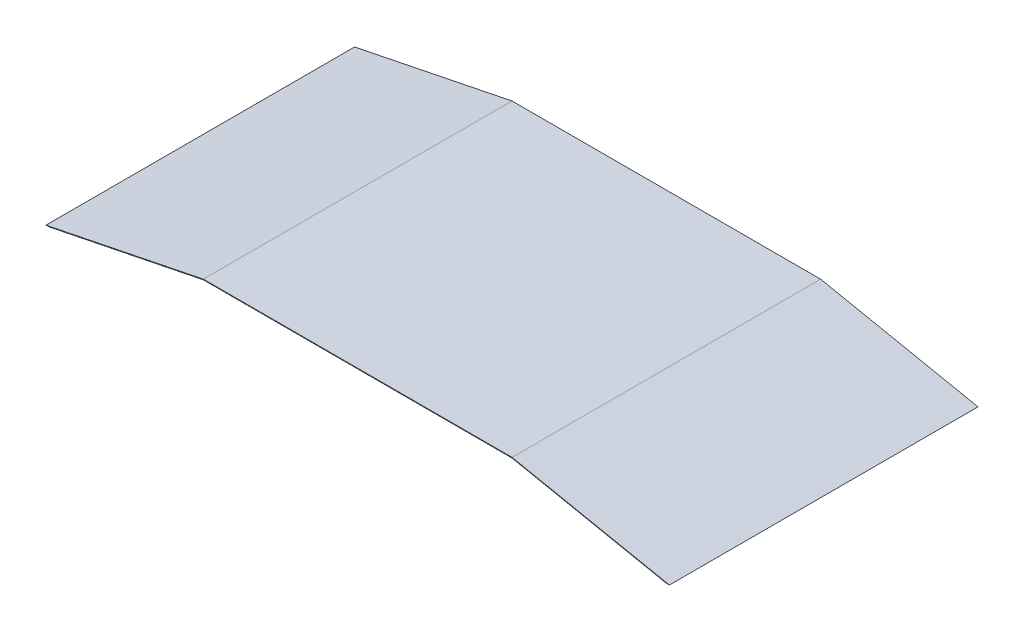
ISO-10303-21;
HEADER;
FILE_DESCRIPTION(('STEP AP214'),'2;1');
FILE_NAME('part.step','',(''),(''),'','','');
FILE_SCHEMA(('AUTOMOTIVE_DESIGN { 1 0 10303 214 1 1 1 1 }'));
ENDSEC;
DATA;
#1=APPLICATION_CONTEXT('core data for automotive mechanical design processes');
#2=APPLICATION_PROTOCOL_DEFINITION('international standard','automotive_design',2000,#1);
#3=PRODUCT_CONTEXT('',#1,'mechanical');
#4=PRODUCT('Part','Part','',(#3));
#5=PRODUCT_RELATED_PRODUCT_CATEGORY('part','',(#4));
#6=PRODUCT_DEFINITION_FORMATION('','',#4);
#7=PRODUCT_DEFINITION_CONTEXT('part definition',#1,'design');
#8=PRODUCT_DEFINITION('design','',#6,#7);
#9=PRODUCT_DEFINITION_SHAPE('','',#8);
#10=(LENGTH_UNIT() NAMED_UNIT(*) SI_UNIT(.MILLI.,.METRE.));
#11=(NAMED_UNIT(*) PLANE_ANGLE_UNIT() SI_UNIT($,.RADIAN.));
#12=(NAMED_UNIT(*) SI_UNIT($,.STERADIAN.) SOLID_ANGLE_UNIT());
#13=UNCERTAINTY_MEASURE_WITH_UNIT(LENGTH_MEASURE(1.E-05),#10,'distance_accuracy_value','');
#14=(GEOMETRIC_REPRESENTATION_CONTEXT(3) GLOBAL_UNCERTAINTY_ASSIGNED_CONTEXT((#13)) GLOBAL_UNIT_ASSIGNED_CONTEXT((#10,
#11,#12)) REPRESENTATION_CONTEXT('',''));
#15=CARTESIAN_POINT('',(0.,0.,0.));
#16=DIRECTION('',(0.,0.,1.));
#17=DIRECTION('',(1.,0.,0.));
#18=AXIS2_PLACEMENT_3D('',#15,#16,#17);
#19=CARTESIAN_POINT('',(50.,10.3382118109419,100.));
#20=DIRECTION('',(0.,-1.,0.));
#21=DIRECTION('',(0.,0.,-1.));
#22=AXIS2_PLACEMENT_3D('',#19,#20,#21);
#23=PLANE('',#22);
#24=DIRECTION('',(-1.,0.,0.));
#25=VECTOR('',#24,1.);
#26=CARTESIAN_POINT('',(50.,10.3382118109419,0.));
#27=LINE('',#26,#25);
#28=CARTESIAN_POINT('',(50.,10.3382118109419,0.));
#29=VERTEX_POINT('',#28);
#30=CARTESIAN_POINT('',(-50.,10.3382118109419,0.));
#31=VERTEX_POINT('',#30);
#32=EDGE_CURVE('E140',#29,#31,#27,.T.);
#33=ORIENTED_EDGE('',*,*,#32,.T.);
#34=DIRECTION('',(0.,0.,-1.));
#35=VECTOR('',#34,1.);
#36=CARTESIAN_POINT('',(-50.,10.3382118109419,100.));
#37=LINE('',#36,#35);
#38=CARTESIAN_POINT('',(-50.,10.3382118109419,100.));
#39=VERTEX_POINT('',#38);
#40=EDGE_CURVE('E11',#39,#31,#37,.T.);
#41=ORIENTED_EDGE('',*,*,#40,.F.);
#42=DIRECTION('',(-1.,0.,0.));
#43=VECTOR('',#42,1.);
#44=CARTESIAN_POINT('',(50.,10.3382118109419,100.));
#45=LINE('',#44,#43);
#46=CARTESIAN_POINT('',(50.,10.3382118109419,100.));
#47=VERTEX_POINT('',#46);
#48=EDGE_CURVE('E162',#47,#39,#45,.T.);
#49=ORIENTED_EDGE('',*,*,#48,.F.);
#50=DIRECTION('',(0.,0.,-1.));
#51=VECTOR('',#50,1.);
#52=CARTESIAN_POINT('',(50.,10.3382118109419,100.));
#53=LINE('',#52,#51);
#54=EDGE_CURVE('E136',#47,#29,#53,.T.);
#55=ORIENTED_EDGE('',*,*,#54,.T.);
#56=EDGE_LOOP('',(#33,#41,#49,#55));
#57=FACE_BOUND('',#56,.T.);
#58=ADVANCED_FACE('F39',(#57),#23,.F.);
#59=CARTESIAN_POINT('',(-101.,0.,100.));
#60=DIRECTION('',(0.198669330795054,-0.980066577841243,0.));
#61=DIRECTION('',(0.980066577841243,0.198669330795054,0.));
#62=AXIS2_PLACEMENT_3D('',#59,#60,#61);
#63=PLANE('',#62);
#64=DIRECTION('',(-0.980066577841243,-0.198669330795054,0.));
#65=VECTOR('',#64,1.);
#66=CARTESIAN_POINT('',(-101.,0.,0.));
#67=LINE('',#66,#65);
#68=CARTESIAN_POINT('',(-101.,0.,0.));
#69=VERTEX_POINT('',#68);
#70=EDGE_CURVE('E144',#31,#69,#67,.T.);
#71=ORIENTED_EDGE('',*,*,#70,.T.);
#72=DIRECTION('',(0.,0.,-1.));
#73=VECTOR('',#72,1.);
#74=CARTESIAN_POINT('',(-101.,0.,100.));
#75=LINE('',#74,#73);
#76=CARTESIAN_POINT('',(-101.,0.,100.));
#77=VERTEX_POINT('',#76);
#78=EDGE_CURVE('E48',#77,#69,#75,.T.);
#79=ORIENTED_EDGE('',*,*,#78,.F.);
#80=DIRECTION('',(-0.980066577841243,-0.198669330795054,0.));
#81=VECTOR('',#80,1.);
#82=CARTESIAN_POINT('',(-101.,0.,100.));
#83=LINE('',#82,#81);
#84=EDGE_CURVE('E99',#39,#77,#83,.T.);
#85=ORIENTED_EDGE('',*,*,#84,.F.);
#86=ORIENTED_EDGE('',*,*,#40,.T.);
#87=EDGE_LOOP('',(#71,#79,#85,#86));
#88=FACE_BOUND('',#87,.T.);
#89=ADVANCED_FACE('F208',(#88),#63,.F.);
#90=CARTESIAN_POINT('',(-100.,0.,100.));
#91=DIRECTION('',(0.,1.,0.));
#92=DIRECTION('',(-1.,0.,0.));
#93=AXIS2_PLACEMENT_3D('',#90,#91,#92);
#94=PLANE('',#93);
#95=DIRECTION('',(1.,0.,0.));
#96=VECTOR('',#95,1.);
#97=CARTESIAN_POINT('',(-100.,0.,0.));
#98=LINE('',#97,#96);
#99=CARTESIAN_POINT('',(-100.,0.,0.));
#100=VERTEX_POINT('',#99);
#101=EDGE_CURVE('E147',#69,#100,#98,.T.);
#102=ORIENTED_EDGE('',*,*,#101,.T.);
#103=DIRECTION('',(0.,0.,-1.));
#104=VECTOR('',#103,1.);
#105=CARTESIAN_POINT('',(-100.,0.,100.));
#106=LINE('',#105,#104);
#107=CARTESIAN_POINT('',(-100.,0.,100.));
#108=VERTEX_POINT('',#107);
#109=EDGE_CURVE('E173',#108,#100,#106,.T.);
#110=ORIENTED_EDGE('',*,*,#109,.F.);
#111=DIRECTION('',(1.,0.,0.));
#112=VECTOR('',#111,1.);
#113=CARTESIAN_POINT('',(-100.,0.,100.));
#114=LINE('',#113,#112);
#115=EDGE_CURVE('E183',#77,#108,#114,.T.);
#116=ORIENTED_EDGE('',*,*,#115,.F.);
#117=ORIENTED_EDGE('',*,*,#78,.T.);
#118=EDGE_LOOP('',(#102,#110,#116,#117));
#119=FACE_BOUND('',#118,.T.);
#120=ADVANCED_FACE('F181',(#119),#94,.F.);
#121=CARTESIAN_POINT('',(-100.,0.,100.));
#122=DIRECTION('',(-0.198669330795054,0.980066577841243,0.));
#123=DIRECTION('',(-0.980066577841243,-0.198669330795054,0.));
#124=AXIS2_PLACEMENT_3D('',#121,#122,#123);
#125=PLANE('',#124);
#126=DIRECTION('',(0.980066577841243,0.198669330795054,0.));
#127=VECTOR('',#126,1.);
#128=CARTESIAN_POINT('',(-100.,0.,0.));
#129=LINE('',#128,#127);
#130=CARTESIAN_POINT('',(-50.,10.1355017754333,0.));
#131=VERTEX_POINT('',#130);
#132=EDGE_CURVE('E150',#100,#131,#129,.T.);
#133=ORIENTED_EDGE('',*,*,#132,.T.);
#134=DIRECTION('',(0.,0.,-1.));
#135=VECTOR('',#134,1.);
#136=CARTESIAN_POINT('',(-50.,10.1355017754333,100.));
#137=LINE('',#136,#135);
#138=CARTESIAN_POINT('',(-50.,10.1355017754333,100.));
#139=VERTEX_POINT('',#138);
#140=EDGE_CURVE('E169',#139,#131,#137,.T.);
#141=ORIENTED_EDGE('',*,*,#140,.F.);
#142=DIRECTION('',(0.980066577841243,0.198669330795054,0.));
#143=VECTOR('',#142,1.);
#144=CARTESIAN_POINT('',(-100.,0.,100.));
#145=LINE('',#144,#143);
#146=EDGE_CURVE('E196',#108,#139,#145,.T.);
#147=ORIENTED_EDGE('',*,*,#146,.F.);
#148=ORIENTED_EDGE('',*,*,#109,.T.);
#149=EDGE_LOOP('',(#133,#141,#147,#148));
#150=FACE_BOUND('',#149,.T.);
#151=ADVANCED_FACE('F191',(#150),#125,.F.);
#152=CARTESIAN_POINT('',(-50.,10.1355017754333,100.));
#153=DIRECTION('',(0.,1.,0.));
#154=DIRECTION('',(0.,0.,1.));
#155=AXIS2_PLACEMENT_3D('',#152,#153,#154);
#156=PLANE('',#155);
#157=DIRECTION('',(1.,0.,0.));
#158=VECTOR('',#157,1.);
#159=CARTESIAN_POINT('',(-50.,10.1355017754333,0.));
#160=LINE('',#159,#158);
#161=CARTESIAN_POINT('',(50.,10.1355017754333,0.));
#162=VERTEX_POINT('',#161);
#163=EDGE_CURVE('E153',#131,#162,#160,.T.);
#164=ORIENTED_EDGE('',*,*,#163,.T.);
#165=DIRECTION('',(0.,0.,-1.));
#166=VECTOR('',#165,1.);
#167=CARTESIAN_POINT('',(50.,10.1355017754333,100.));
#168=LINE('',#167,#166);
#169=CARTESIAN_POINT('',(50.,10.1355017754333,100.));
#170=VERTEX_POINT('',#169);
#171=EDGE_CURVE('E129',#170,#162,#168,.T.);
#172=ORIENTED_EDGE('',*,*,#171,.F.);
#173=DIRECTION('',(1.,0.,0.));
#174=VECTOR('',#173,1.);
#175=CARTESIAN_POINT('',(-50.,10.1355017754333,100.));
#176=LINE('',#175,#174);
#177=EDGE_CURVE('E118',#139,#170,#176,.T.);
#178=ORIENTED_EDGE('',*,*,#177,.F.);
#179=ORIENTED_EDGE('',*,*,#140,.T.);
#180=EDGE_LOOP('',(#164,#172,#178,#179));
#181=FACE_BOUND('',#180,.T.);
#182=ADVANCED_FACE('F194',(#181),#156,.F.);
#183=CARTESIAN_POINT('',(100.,0.,100.));
#184=DIRECTION('',(0.198669330795055,0.980066577841243,0.));
#185=DIRECTION('',(-0.980066577841243,0.198669330795055,0.));
#186=AXIS2_PLACEMENT_3D('',#183,#184,#185);
#187=PLANE('',#186);
#188=DIRECTION('',(0.980066577841243,-0.198669330795055,0.));
#189=VECTOR('',#188,1.);
#190=CARTESIAN_POINT('',(100.,0.,0.));
#191=LINE('',#190,#189);
#192=CARTESIAN_POINT('',(100.,0.,0.));
#193=VERTEX_POINT('',#192);
#194=EDGE_CURVE('E127',#162,#193,#191,.T.);
#195=ORIENTED_EDGE('',*,*,#194,.T.);
#196=DIRECTION('',(0.,0.,-1.));
#197=VECTOR('',#196,1.);
#198=CARTESIAN_POINT('',(100.,0.,100.));
#199=LINE('',#198,#197);
#200=CARTESIAN_POINT('',(100.,0.,100.));
#201=VERTEX_POINT('',#200);
#202=EDGE_CURVE('E124',#201,#193,#199,.T.);
#203=ORIENTED_EDGE('',*,*,#202,.F.);
#204=DIRECTION('',(0.980066577841243,-0.198669330795055,0.));
#205=VECTOR('',#204,1.);
#206=CARTESIAN_POINT('',(100.,0.,100.));
#207=LINE('',#206,#205);
#208=EDGE_CURVE('E112',#170,#201,#207,.T.);
#209=ORIENTED_EDGE('',*,*,#208,.F.);
#210=ORIENTED_EDGE('',*,*,#171,.T.);
#211=EDGE_LOOP('',(#195,#203,#209,#210));
#212=FACE_BOUND('',#211,.T.);
#213=ADVANCED_FACE('F125',(#212),#187,.F.);
#214=CARTESIAN_POINT('',(100.,0.,100.));
#215=DIRECTION('',(0.,1.,0.));
#216=DIRECTION('',(-1.,0.,0.));
#217=AXIS2_PLACEMENT_3D('',#214,#215,#216);
#218=PLANE('',#217);
#219=DIRECTION('',(1.,0.,0.));
#220=VECTOR('',#219,1.);
#221=CARTESIAN_POINT('',(100.,0.,0.));
#222=LINE('',#221,#220);
#223=CARTESIAN_POINT('',(101.,0.,0.));
#224=VERTEX_POINT('',#223);
#225=EDGE_CURVE('E85',#193,#224,#222,.T.);
#226=ORIENTED_EDGE('',*,*,#225,.T.);
#227=DIRECTION('',(0.,0.,-1.));
#228=VECTOR('',#227,1.);
#229=CARTESIAN_POINT('',(101.,0.,100.));
#230=LINE('',#229,#228);
#231=CARTESIAN_POINT('',(101.,0.,100.));
#232=VERTEX_POINT('',#231);
#233=EDGE_CURVE('E130',#232,#224,#230,.T.);
#234=ORIENTED_EDGE('',*,*,#233,.F.);
#235=DIRECTION('',(1.,0.,0.));
#236=VECTOR('',#235,1.);
#237=CARTESIAN_POINT('',(100.,0.,100.));
#238=LINE('',#237,#236);
#239=EDGE_CURVE('E116',#201,#232,#238,.T.);
#240=ORIENTED_EDGE('',*,*,#239,.F.);
#241=ORIENTED_EDGE('',*,*,#202,.T.);
#242=EDGE_LOOP('',(#226,#234,#240,#241));
#243=FACE_BOUND('',#242,.T.);
#244=ADVANCED_FACE('F132',(#243),#218,.F.);
#245=CARTESIAN_POINT('',(101.,0.,100.));
#246=DIRECTION('',(-0.198669330795054,-0.980066577841243,0.));
#247=DIRECTION('',(0.980066577841243,-0.198669330795054,0.));
#248=AXIS2_PLACEMENT_3D('',#245,#246,#247);
#249=PLANE('',#248);
#250=DIRECTION('',(-0.980066577841243,0.198669330795054,0.));
#251=VECTOR('',#250,1.);
#252=CARTESIAN_POINT('',(101.,0.,0.));
#253=LINE('',#252,#251);
#254=EDGE_CURVE('E91',#224,#29,#253,.T.);
#255=ORIENTED_EDGE('',*,*,#254,.T.);
#256=ORIENTED_EDGE('',*,*,#54,.F.);
#257=DIRECTION('',(-0.980066577841243,0.198669330795054,0.));
#258=VECTOR('',#257,1.);
#259=CARTESIAN_POINT('',(101.,0.,100.));
#260=LINE('',#259,#258);
#261=EDGE_CURVE('E56',#232,#47,#260,.T.);
#262=ORIENTED_EDGE('',*,*,#261,.F.);
#263=ORIENTED_EDGE('',*,*,#233,.T.);
#264=EDGE_LOOP('',(#255,#256,#262,#263));
#265=FACE_BOUND('',#264,.T.);
#266=ADVANCED_FACE('F224',(#265),#249,.F.);
#267=CARTESIAN_POINT('',(0.,0.,100.));
#268=DIRECTION('',(0.,0.,-1.));
#269=DIRECTION('',(-1.,0.,0.));
#270=AXIS2_PLACEMENT_3D('',#267,#268,#269);
#271=PLANE('',#270);
#272=ORIENTED_EDGE('',*,*,#48,.T.);
#273=ORIENTED_EDGE('',*,*,#84,.T.);
#274=ORIENTED_EDGE('',*,*,#115,.T.);
#275=ORIENTED_EDGE('',*,*,#146,.T.);
#276=ORIENTED_EDGE('',*,*,#177,.T.);
#277=ORIENTED_EDGE('',*,*,#208,.T.);
#278=ORIENTED_EDGE('',*,*,#239,.T.);
#279=ORIENTED_EDGE('',*,*,#261,.T.);
#280=EDGE_LOOP('',(#272,#273,#274,#275,#276,#277,#278,#279));
#281=FACE_BOUND('',#280,.T.);
#282=ADVANCED_FACE('F114',(#281),#271,.F.);
#283=CARTESIAN_POINT('',(0.,0.,0.));
#284=DIRECTION('',(0.,0.,-1.));
#285=DIRECTION('',(-1.,0.,0.));
#286=AXIS2_PLACEMENT_3D('',#283,#284,#285);
#287=PLANE('',#286);
#288=ORIENTED_EDGE('',*,*,#32,.F.);
#289=ORIENTED_EDGE('',*,*,#254,.F.);
#290=ORIENTED_EDGE('',*,*,#225,.F.);
#291=ORIENTED_EDGE('',*,*,#194,.F.);
#292=ORIENTED_EDGE('',*,*,#163,.F.);
#293=ORIENTED_EDGE('',*,*,#132,.F.);
#294=ORIENTED_EDGE('',*,*,#101,.F.);
#295=ORIENTED_EDGE('',*,*,#70,.F.);
#296=EDGE_LOOP('',(#288,#289,#290,#291,#292,#293,#294,#295));
#297=FACE_BOUND('',#296,.T.);
#298=ADVANCED_FACE('F187',(#297),#287,.T.);
#299=CLOSED_SHELL('',(#58,#89,#120,#151,#182,#213,#244,#266,#282,#298));
#300=MANIFOLD_SOLID_BREP('B2',#299);
#301=ADVANCED_BREP_SHAPE_REPRESENTATION('',(#18,#300),#14);
#302=SHAPE_DEFINITION_REPRESENTATION(#9,#301);
ENDSEC;
END-ISO-10303-21;
